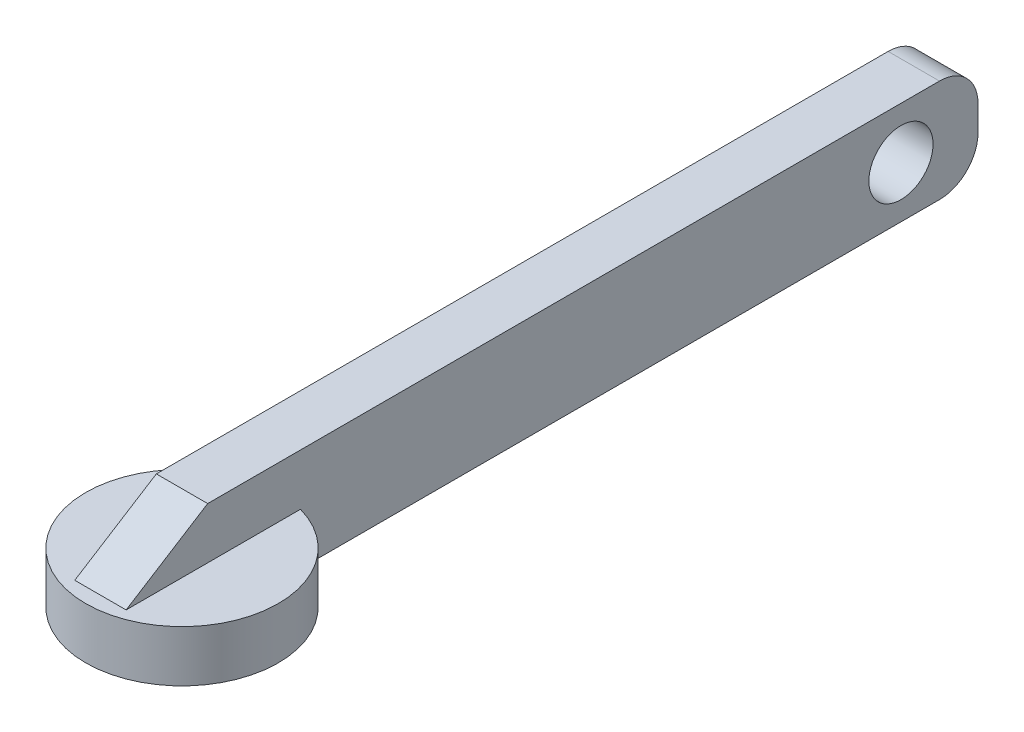
ISO-10303-21;
HEADER;
FILE_DESCRIPTION(('STEP AP214'),'2;1');
FILE_NAME('part.step','',(''),(''),'','','');
FILE_SCHEMA(('AUTOMOTIVE_DESIGN { 1 0 10303 214 1 1 1 1 }'));
ENDSEC;
DATA;
#1=APPLICATION_CONTEXT('core data for automotive mechanical design processes');
#2=APPLICATION_PROTOCOL_DEFINITION('international standard','automotive_design',2000,#1);
#3=PRODUCT_CONTEXT('',#1,'mechanical');
#4=PRODUCT('Part','Part','',(#3));
#5=PRODUCT_RELATED_PRODUCT_CATEGORY('part','',(#4));
#6=PRODUCT_DEFINITION_FORMATION('','',#4);
#7=PRODUCT_DEFINITION_CONTEXT('part definition',#1,'design');
#8=PRODUCT_DEFINITION('design','',#6,#7);
#9=PRODUCT_DEFINITION_SHAPE('','',#8);
#10=(LENGTH_UNIT() NAMED_UNIT(*) SI_UNIT(.MILLI.,.METRE.));
#11=(NAMED_UNIT(*) PLANE_ANGLE_UNIT() SI_UNIT($,.RADIAN.));
#12=(NAMED_UNIT(*) SI_UNIT($,.STERADIAN.) SOLID_ANGLE_UNIT());
#13=UNCERTAINTY_MEASURE_WITH_UNIT(LENGTH_MEASURE(1.E-05),#10,'distance_accuracy_value','');
#14=(GEOMETRIC_REPRESENTATION_CONTEXT(3) GLOBAL_UNCERTAINTY_ASSIGNED_CONTEXT((#13)) GLOBAL_UNIT_ASSIGNED_CONTEXT((#10,
#11,#12)) REPRESENTATION_CONTEXT('',''));
#15=CARTESIAN_POINT('',(0.,0.,0.));
#16=DIRECTION('',(0.,0.,1.));
#17=DIRECTION('',(1.,0.,0.));
#18=AXIS2_PLACEMENT_3D('',#15,#16,#17);
#19=CARTESIAN_POINT('',(2.,8.,30.));
#20=DIRECTION('',(-1.,0.,0.));
#21=DIRECTION('',(0.,0.,1.));
#22=AXIS2_PLACEMENT_3D('',#19,#20,#21);
#23=PLANE('',#22);
#24=CARTESIAN_POINT('',(2.,4.,-24.));
#25=DIRECTION('',(-1.,0.,0.));
#26=DIRECTION('',(0.,0.,1.));
#27=AXIS2_PLACEMENT_3D('',#24,#25,#26);
#28=CIRCLE('',#27,2.5);
#29=CARTESIAN_POINT('',(2.,4.,-21.5));
#30=VERTEX_POINT('',#29);
#31=EDGE_CURVE('E139',#30,#30,#28,.T.);
#32=ORIENTED_EDGE('',*,*,#31,.T.);
#33=EDGE_LOOP('',(#32));
#34=FACE_BOUND('',#33,.T.);
#35=DIRECTION('',(0.,0.,1.));
#36=VECTOR('',#35,1.);
#37=CARTESIAN_POINT('',(2.,4.,30.));
#38=LINE('',#37,#36);
#39=CARTESIAN_POINT('',(2.,4.,22.7715838525995));
#40=VERTEX_POINT('',#39);
#41=CARTESIAN_POINT('',(2.,4.,36.3517218887459));
#42=VERTEX_POINT('',#41);
#43=EDGE_CURVE('E55',#40,#42,#38,.T.);
#44=ORIENTED_EDGE('',*,*,#43,.F.);
#45=DIRECTION('',(0.,-1.,0.));
#46=VECTOR('',#45,1.);
#47=CARTESIAN_POINT('',(2.,4.,22.7715838525995));
#48=LINE('',#47,#46);
#49=CARTESIAN_POINT('',(2.,0.,22.7715838525995));
#50=VERTEX_POINT('',#49);
#51=EDGE_CURVE('E132',#40,#50,#48,.T.);
#52=ORIENTED_EDGE('',*,*,#51,.T.);
#53=DIRECTION('',(0.,0.,-1.));
#54=VECTOR('',#53,1.);
#55=CARTESIAN_POINT('',(2.,0.,30.));
#56=LINE('',#55,#54);
#57=CARTESIAN_POINT('',(2.,0.,-27.));
#58=VERTEX_POINT('',#57);
#59=EDGE_CURVE('E142',#50,#58,#56,.T.);
#60=ORIENTED_EDGE('',*,*,#59,.T.);
#61=CARTESIAN_POINT('',(2.,3.,-27.));
#62=DIRECTION('',(-1.,0.,0.));
#63=DIRECTION('',(0.,0.,1.));
#64=AXIS2_PLACEMENT_3D('',#61,#62,#63);
#65=CIRCLE('',#64,3.);
#66=CARTESIAN_POINT('',(2.,3.,-30.));
#67=VERTEX_POINT('',#66);
#68=EDGE_CURVE('E162',#58,#67,#65,.F.);
#69=ORIENTED_EDGE('',*,*,#68,.T.);
#70=DIRECTION('',(0.,-1.,0.));
#71=VECTOR('',#70,1.);
#72=CARTESIAN_POINT('',(2.,8.,-30.));
#73=LINE('',#72,#71);
#74=CARTESIAN_POINT('',(2.,5.,-30.));
#75=VERTEX_POINT('',#74);
#76=EDGE_CURVE('E149',#75,#67,#73,.T.);
#77=ORIENTED_EDGE('',*,*,#76,.F.);
#78=CARTESIAN_POINT('',(2.,5.,-27.));
#79=DIRECTION('',(-1.,0.,0.));
#80=DIRECTION('',(0.,0.,1.));
#81=AXIS2_PLACEMENT_3D('',#78,#79,#80);
#82=CIRCLE('',#81,3.);
#83=CARTESIAN_POINT('',(2.,8.,-27.));
#84=VERTEX_POINT('',#83);
#85=EDGE_CURVE('E41',#75,#84,#82,.F.);
#86=ORIENTED_EDGE('',*,*,#85,.T.);
#87=DIRECTION('',(0.,0.,-1.));
#88=VECTOR('',#87,1.);
#89=CARTESIAN_POINT('',(2.,8.,30.));
#90=LINE('',#89,#88);
#91=CARTESIAN_POINT('',(2.,8.,30.));
#92=VERTEX_POINT('',#91);
#93=EDGE_CURVE('E107',#92,#84,#90,.T.);
#94=ORIENTED_EDGE('',*,*,#93,.F.);
#95=DIRECTION('',(0.,-0.532886507270041,0.84618672311112));
#96=VECTOR('',#95,1.);
#97=CARTESIAN_POINT('',(2.,4.,36.3517218887459));
#98=LINE('',#97,#96);
#99=EDGE_CURVE('E115',#92,#42,#98,.T.);
#100=ORIENTED_EDGE('',*,*,#99,.T.);
#101=EDGE_LOOP('',(#44,#52,#60,#69,#77,#86,#94,#100));
#102=FACE_BOUND('',#101,.T.);
#103=ADVANCED_FACE('F33',(#34,#102),#23,.F.);
#104=CARTESIAN_POINT('',(-2.,8.,-30.));
#105=DIRECTION('',(0.,0.,1.));
#106=DIRECTION('',(1.,0.,0.));
#107=AXIS2_PLACEMENT_3D('',#104,#105,#106);
#108=PLANE('',#107);
#109=DIRECTION('',(0.,-1.,0.));
#110=VECTOR('',#109,1.);
#111=CARTESIAN_POINT('',(-2.,8.,-30.));
#112=LINE('',#111,#110);
#113=CARTESIAN_POINT('',(-2.,5.,-30.));
#114=VERTEX_POINT('',#113);
#115=CARTESIAN_POINT('',(-2.,3.,-30.));
#116=VERTEX_POINT('',#115);
#117=EDGE_CURVE('E116',#114,#116,#112,.T.);
#118=ORIENTED_EDGE('',*,*,#117,.F.);
#119=DIRECTION('',(-1.,0.,0.));
#120=VECTOR('',#119,1.);
#121=CARTESIAN_POINT('',(-2.,5.,-30.));
#122=LINE('',#121,#120);
#123=EDGE_CURVE('E160',#114,#75,#122,.F.);
#124=ORIENTED_EDGE('',*,*,#123,.T.);
#125=ORIENTED_EDGE('',*,*,#76,.T.);
#126=DIRECTION('',(-1.,0.,0.));
#127=VECTOR('',#126,1.);
#128=CARTESIAN_POINT('',(-2.,3.,-30.));
#129=LINE('',#128,#127);
#130=EDGE_CURVE('E157',#67,#116,#129,.T.);
#131=ORIENTED_EDGE('',*,*,#130,.T.);
#132=EDGE_LOOP('',(#118,#124,#125,#131));
#133=FACE_BOUND('',#132,.T.);
#134=ADVANCED_FACE('F171',(#133),#108,.F.);
#135=CARTESIAN_POINT('',(-2.,8.,30.));
#136=DIRECTION('',(1.,0.,0.));
#137=DIRECTION('',(0.,0.,-1.));
#138=AXIS2_PLACEMENT_3D('',#135,#136,#137);
#139=PLANE('',#138);
#140=CARTESIAN_POINT('',(-2.,4.,-24.));
#141=DIRECTION('',(-1.,0.,0.));
#142=DIRECTION('',(0.,0.,1.));
#143=AXIS2_PLACEMENT_3D('',#140,#141,#142);
#144=CIRCLE('',#143,2.5);
#145=CARTESIAN_POINT('',(-2.,4.,-21.5));
#146=VERTEX_POINT('',#145);
#147=EDGE_CURVE('E136',#146,#146,#144,.T.);
#148=ORIENTED_EDGE('',*,*,#147,.F.);
#149=EDGE_LOOP('',(#148));
#150=FACE_BOUND('',#149,.T.);
#151=DIRECTION('',(0.,0.,1.));
#152=VECTOR('',#151,1.);
#153=CARTESIAN_POINT('',(-2.,0.,30.));
#154=LINE('',#153,#152);
#155=CARTESIAN_POINT('',(-2.,0.,-27.));
#156=VERTEX_POINT('',#155);
#157=CARTESIAN_POINT('',(-2.,0.,22.7715838525995));
#158=VERTEX_POINT('',#157);
#159=EDGE_CURVE('E143',#156,#158,#154,.T.);
#160=ORIENTED_EDGE('',*,*,#159,.T.);
#161=DIRECTION('',(0.,-1.,0.));
#162=VECTOR('',#161,1.);
#163=CARTESIAN_POINT('',(-2.,4.,22.7715838525995));
#164=LINE('',#163,#162);
#165=CARTESIAN_POINT('',(-2.,4.,22.7715838525995));
#166=VERTEX_POINT('',#165);
#167=EDGE_CURVE('E128',#158,#166,#164,.F.);
#168=ORIENTED_EDGE('',*,*,#167,.T.);
#169=DIRECTION('',(0.,0.,-1.));
#170=VECTOR('',#169,1.);
#171=CARTESIAN_POINT('',(-2.,4.,30.));
#172=LINE('',#171,#170);
#173=CARTESIAN_POINT('',(-2.,4.,36.3517218887459));
#174=VERTEX_POINT('',#173);
#175=EDGE_CURVE('E48',#174,#166,#172,.T.);
#176=ORIENTED_EDGE('',*,*,#175,.F.);
#177=DIRECTION('',(0.,-0.532886507270041,0.84618672311112));
#178=VECTOR('',#177,1.);
#179=CARTESIAN_POINT('',(-2.,4.,36.3517218887459));
#180=LINE('',#179,#178);
#181=CARTESIAN_POINT('',(-2.,8.,30.));
#182=VERTEX_POINT('',#181);
#183=EDGE_CURVE('E113',#182,#174,#180,.T.);
#184=ORIENTED_EDGE('',*,*,#183,.F.);
#185=DIRECTION('',(0.,0.,1.));
#186=VECTOR('',#185,1.);
#187=CARTESIAN_POINT('',(-2.,8.,30.));
#188=LINE('',#187,#186);
#189=CARTESIAN_POINT('',(-2.,8.,-27.));
#190=VERTEX_POINT('',#189);
#191=EDGE_CURVE('E99',#190,#182,#188,.T.);
#192=ORIENTED_EDGE('',*,*,#191,.F.);
#193=CARTESIAN_POINT('',(-2.,5.,-27.));
#194=DIRECTION('',(1.,0.,0.));
#195=DIRECTION('',(0.,0.,-1.));
#196=AXIS2_PLACEMENT_3D('',#193,#194,#195);
#197=CIRCLE('',#196,3.);
#198=EDGE_CURVE('E155',#190,#114,#197,.F.);
#199=ORIENTED_EDGE('',*,*,#198,.T.);
#200=ORIENTED_EDGE('',*,*,#117,.T.);
#201=CARTESIAN_POINT('',(-2.,3.,-27.));
#202=DIRECTION('',(1.,0.,0.));
#203=DIRECTION('',(0.,0.,-1.));
#204=AXIS2_PLACEMENT_3D('',#201,#202,#203);
#205=CIRCLE('',#204,3.);
#206=EDGE_CURVE('E153',#116,#156,#205,.F.);
#207=ORIENTED_EDGE('',*,*,#206,.T.);
#208=EDGE_LOOP('',(#160,#168,#176,#184,#192,#199,#200,#207));
#209=FACE_BOUND('',#208,.T.);
#210=ADVANCED_FACE('F118',(#150,#209),#139,.F.);
#211=CARTESIAN_POINT('',(0.,8.,0.));
#212=DIRECTION('',(0.,-1.,0.));
#213=DIRECTION('',(0.,0.,-1.));
#214=AXIS2_PLACEMENT_3D('',#211,#212,#213);
#215=PLANE('',#214);
#216=ORIENTED_EDGE('',*,*,#93,.T.);
#217=DIRECTION('',(-1.,0.,0.));
#218=VECTOR('',#217,1.);
#219=CARTESIAN_POINT('',(0.,8.,-27.));
#220=LINE('',#219,#218);
#221=EDGE_CURVE('E106',#84,#190,#220,.T.);
#222=ORIENTED_EDGE('',*,*,#221,.T.);
#223=ORIENTED_EDGE('',*,*,#191,.T.);
#224=DIRECTION('',(1.,0.,0.));
#225=VECTOR('',#224,1.);
#226=CARTESIAN_POINT('',(-2.,8.,30.));
#227=LINE('',#226,#225);
#228=EDGE_CURVE('E103',#182,#92,#227,.T.);
#229=ORIENTED_EDGE('',*,*,#228,.T.);
#230=EDGE_LOOP('',(#216,#222,#223,#229));
#231=FACE_BOUND('',#230,.T.);
#232=ADVANCED_FACE('F102',(#231),#215,.F.);
#233=CARTESIAN_POINT('',(0.,0.,0.));
#234=DIRECTION('',(0.,-1.,0.));
#235=DIRECTION('',(0.,0.,-1.));
#236=AXIS2_PLACEMENT_3D('',#233,#234,#235);
#237=PLANE('',#236);
#238=ORIENTED_EDGE('',*,*,#59,.F.);
#239=CARTESIAN_POINT('',(0.,0.,30.));
#240=DIRECTION('',(0.,-1.,0.));
#241=DIRECTION('',(0.,0.,-1.));
#242=AXIS2_PLACEMENT_3D('',#239,#240,#241);
#243=CIRCLE('',#242,7.5);
#244=EDGE_CURVE('E121',#50,#158,#243,.T.);
#245=ORIENTED_EDGE('',*,*,#244,.T.);
#246=ORIENTED_EDGE('',*,*,#159,.F.);
#247=DIRECTION('',(-1.,0.,0.));
#248=VECTOR('',#247,1.);
#249=CARTESIAN_POINT('',(2.,0.,-27.));
#250=LINE('',#249,#248);
#251=EDGE_CURVE('E11',#156,#58,#250,.F.);
#252=ORIENTED_EDGE('',*,*,#251,.T.);
#253=EDGE_LOOP('',(#238,#245,#246,#252));
#254=FACE_BOUND('',#253,.T.);
#255=ADVANCED_FACE('F180',(#254),#237,.T.);
#256=CARTESIAN_POINT('',(6.,4.,-24.));
#257=DIRECTION('',(-1.,0.,0.));
#258=DIRECTION('',(0.,0.,1.));
#259=AXIS2_PLACEMENT_3D('',#256,#257,#258);
#260=CYLINDRICAL_SURFACE('',#259,2.5);
#261=ORIENTED_EDGE('',*,*,#147,.T.);
#262=EDGE_LOOP('',(#261));
#263=FACE_BOUND('',#262,.T.);
#264=ORIENTED_EDGE('',*,*,#31,.F.);
#265=EDGE_LOOP('',(#264));
#266=FACE_BOUND('',#265,.T.);
#267=ADVANCED_FACE('F203',(#263,#266),#260,.F.);
#268=CARTESIAN_POINT('',(0.,5.,-27.));
#269=DIRECTION('',(-1.,0.,0.));
#270=DIRECTION('',(0.,0.,1.));
#271=AXIS2_PLACEMENT_3D('',#268,#269,#270);
#272=CYLINDRICAL_SURFACE('',#271,3.);
#273=ORIENTED_EDGE('',*,*,#85,.F.);
#274=ORIENTED_EDGE('',*,*,#123,.F.);
#275=ORIENTED_EDGE('',*,*,#198,.F.);
#276=ORIENTED_EDGE('',*,*,#221,.F.);
#277=EDGE_LOOP('',(#273,#274,#275,#276));
#278=FACE_BOUND('',#277,.T.);
#279=ADVANCED_FACE('F168',(#278),#272,.T.);
#280=CARTESIAN_POINT('',(-2.,3.,-27.));
#281=DIRECTION('',(1.,0.,0.));
#282=DIRECTION('',(0.,0.,-1.));
#283=AXIS2_PLACEMENT_3D('',#280,#281,#282);
#284=CYLINDRICAL_SURFACE('',#283,3.);
#285=ORIENTED_EDGE('',*,*,#68,.F.);
#286=ORIENTED_EDGE('',*,*,#251,.F.);
#287=ORIENTED_EDGE('',*,*,#206,.F.);
#288=ORIENTED_EDGE('',*,*,#130,.F.);
#289=EDGE_LOOP('',(#285,#286,#287,#288));
#290=FACE_BOUND('',#289,.T.);
#291=ADVANCED_FACE('F35',(#290),#284,.T.);
#292=CARTESIAN_POINT('',(0.,4.,30.));
#293=DIRECTION('',(0.,-1.,0.));
#294=DIRECTION('',(0.,0.,-1.));
#295=AXIS2_PLACEMENT_3D('',#292,#293,#294);
#296=PLANE('',#295);
#297=DIRECTION('',(1.,0.,0.));
#298=VECTOR('',#297,1.);
#299=CARTESIAN_POINT('',(-2.,4.,36.3517218887459));
#300=LINE('',#299,#298);
#301=EDGE_CURVE('E119',#174,#42,#300,.T.);
#302=ORIENTED_EDGE('',*,*,#301,.F.);
#303=ORIENTED_EDGE('',*,*,#175,.T.);
#304=CARTESIAN_POINT('',(0.,4.,30.));
#305=DIRECTION('',(0.,-1.,0.));
#306=DIRECTION('',(0.,0.,-1.));
#307=AXIS2_PLACEMENT_3D('',#304,#305,#306);
#308=CIRCLE('',#307,7.5);
#309=EDGE_CURVE('E125',#40,#166,#308,.T.);
#310=ORIENTED_EDGE('',*,*,#309,.F.);
#311=ORIENTED_EDGE('',*,*,#43,.T.);
#312=EDGE_LOOP('',(#302,#303,#310,#311));
#313=FACE_BOUND('',#312,.T.);
#314=ADVANCED_FACE('F185',(#313),#296,.F.);
#315=CARTESIAN_POINT('',(0.,4.,30.));
#316=DIRECTION('',(0.,-1.,0.));
#317=DIRECTION('',(0.,0.,-1.));
#318=AXIS2_PLACEMENT_3D('',#315,#316,#317);
#319=CYLINDRICAL_SURFACE('',#318,7.5);
#320=ORIENTED_EDGE('',*,*,#51,.F.);
#321=ORIENTED_EDGE('',*,*,#309,.T.);
#322=ORIENTED_EDGE('',*,*,#167,.F.);
#323=ORIENTED_EDGE('',*,*,#244,.F.);
#324=EDGE_LOOP('',(#320,#321,#322,#323));
#325=FACE_BOUND('',#324,.T.);
#326=ADVANCED_FACE('F184',(#325),#319,.T.);
#327=CARTESIAN_POINT('',(-2.,4.,36.3517218887459));
#328=DIRECTION('',(0.,0.84618672311112,0.532886507270041));
#329=DIRECTION('',(0.,-0.532886507270041,0.84618672311112));
#330=AXIS2_PLACEMENT_3D('',#327,#328,#329);
#331=PLANE('',#330);
#332=ORIENTED_EDGE('',*,*,#99,.F.);
#333=ORIENTED_EDGE('',*,*,#228,.F.);
#334=ORIENTED_EDGE('',*,*,#183,.T.);
#335=ORIENTED_EDGE('',*,*,#301,.T.);
#336=EDGE_LOOP('',(#332,#333,#334,#335));
#337=FACE_BOUND('',#336,.T.);
#338=ADVANCED_FACE('F112',(#337),#331,.T.);
#339=CLOSED_SHELL('',(#103,#134,#210,#232,#255,#267,#279,#291,#314,#326,#338));
#340=MANIFOLD_SOLID_BREP('B2',#339);
#341=ADVANCED_BREP_SHAPE_REPRESENTATION('',(#18,#340),#14);
#342=SHAPE_DEFINITION_REPRESENTATION(#9,#341);
ENDSEC;
END-ISO-10303-21;
